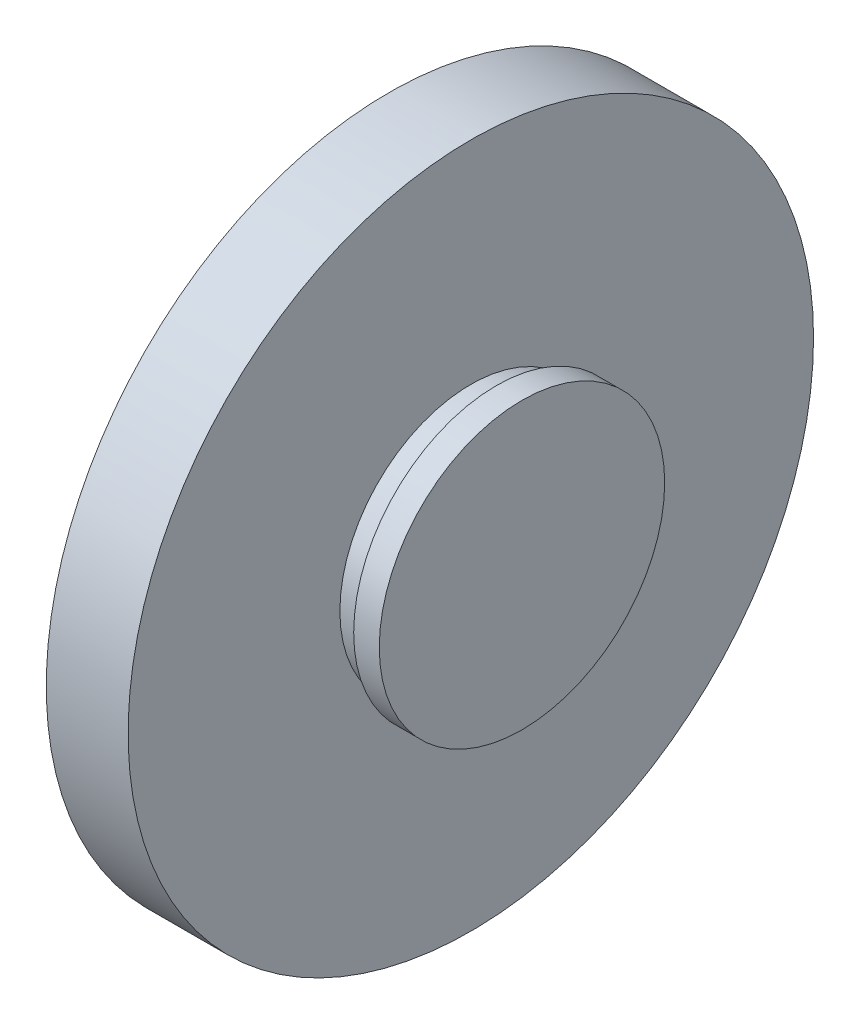
ISO-10303-21;
HEADER;
FILE_DESCRIPTION(('STEP AP214'),'2;1');
FILE_NAME('part.step','',(''),(''),'','','');
FILE_SCHEMA(('AUTOMOTIVE_DESIGN { 1 0 10303 214 1 1 1 1 }'));
ENDSEC;
DATA;
#1=APPLICATION_CONTEXT('core data for automotive mechanical design processes');
#2=APPLICATION_PROTOCOL_DEFINITION('international standard','automotive_design',2000,#1);
#3=PRODUCT_CONTEXT('',#1,'mechanical');
#4=PRODUCT('Part','Part','',(#3));
#5=PRODUCT_RELATED_PRODUCT_CATEGORY('part','',(#4));
#6=PRODUCT_DEFINITION_FORMATION('','',#4);
#7=PRODUCT_DEFINITION_CONTEXT('part definition',#1,'design');
#8=PRODUCT_DEFINITION('design','',#6,#7);
#9=PRODUCT_DEFINITION_SHAPE('','',#8);
#10=(LENGTH_UNIT() NAMED_UNIT(*) SI_UNIT(.MILLI.,.METRE.));
#11=(NAMED_UNIT(*) PLANE_ANGLE_UNIT() SI_UNIT($,.RADIAN.));
#12=(NAMED_UNIT(*) SI_UNIT($,.STERADIAN.) SOLID_ANGLE_UNIT());
#13=UNCERTAINTY_MEASURE_WITH_UNIT(LENGTH_MEASURE(1.E-05),#10,'distance_accuracy_value','');
#14=(GEOMETRIC_REPRESENTATION_CONTEXT(3) GLOBAL_UNCERTAINTY_ASSIGNED_CONTEXT((#13)) GLOBAL_UNIT_ASSIGNED_CONTEXT((#10,
#11,#12)) REPRESENTATION_CONTEXT('',''));
#15=CARTESIAN_POINT('',(0.,0.,0.));
#16=DIRECTION('',(0.,0.,1.));
#17=DIRECTION('',(1.,0.,0.));
#18=AXIS2_PLACEMENT_3D('',#15,#16,#17);
#19=CARTESIAN_POINT('',(8.,0.,0.));
#20=DIRECTION('',(-1.,0.,0.));
#21=DIRECTION('',(0.,0.,1.));
#22=AXIS2_PLACEMENT_3D('',#19,#20,#21);
#23=CYLINDRICAL_SURFACE('',#22,33.5);
#24=CARTESIAN_POINT('',(8.,0.,0.));
#25=DIRECTION('',(1.,0.,0.));
#26=DIRECTION('',(0.,0.,-1.));
#27=AXIS2_PLACEMENT_3D('',#24,#25,#26);
#28=CIRCLE('',#27,33.5);
#29=CARTESIAN_POINT('',(8.,0.,-33.5));
#30=VERTEX_POINT('',#29);
#31=EDGE_CURVE('E41',#30,#30,#28,.T.);
#32=ORIENTED_EDGE('',*,*,#31,.F.);
#33=EDGE_LOOP('',(#32));
#34=FACE_BOUND('',#33,.T.);
#35=CARTESIAN_POINT('',(0.,0.,0.));
#36=DIRECTION('',(1.,0.,0.));
#37=DIRECTION('',(0.,0.,-1.));
#38=AXIS2_PLACEMENT_3D('',#35,#36,#37);
#39=CIRCLE('',#38,33.5);
#40=CARTESIAN_POINT('',(0.,0.,-33.5));
#41=VERTEX_POINT('',#40);
#42=EDGE_CURVE('E36',#41,#41,#39,.T.);
#43=ORIENTED_EDGE('',*,*,#42,.T.);
#44=EDGE_LOOP('',(#43));
#45=FACE_BOUND('',#44,.T.);
#46=ADVANCED_FACE('F33',(#34,#45),#23,.T.);
#47=CARTESIAN_POINT('',(8.,0.,0.));
#48=DIRECTION('',(1.,0.,0.));
#49=DIRECTION('',(0.,0.,-1.));
#50=AXIS2_PLACEMENT_3D('',#47,#48,#49);
#51=PLANE('',#50);
#52=CARTESIAN_POINT('',(8.,0.,0.));
#53=DIRECTION('',(1.,0.,0.));
#54=DIRECTION('',(0.,0.,-1.));
#55=AXIS2_PLACEMENT_3D('',#52,#53,#54);
#56=CIRCLE('',#55,12.8);
#57=CARTESIAN_POINT('',(8.,0.,-12.8));
#58=VERTEX_POINT('',#57);
#59=EDGE_CURVE('E11',#58,#58,#56,.T.);
#60=ORIENTED_EDGE('',*,*,#59,.F.);
#61=EDGE_LOOP('',(#60));
#62=FACE_BOUND('',#61,.T.);
#63=ORIENTED_EDGE('',*,*,#31,.T.);
#64=EDGE_LOOP('',(#63));
#65=FACE_BOUND('',#64,.T.);
#66=ADVANCED_FACE('F226',(#62,#65),#51,.T.);
#67=CARTESIAN_POINT('',(0.,0.,0.));
#68=DIRECTION('',(1.,0.,0.));
#69=DIRECTION('',(0.,0.,-1.));
#70=AXIS2_PLACEMENT_3D('',#67,#68,#69);
#71=PLANE('',#70);
#72=DIRECTION('',(0.,-0.119879149923698,0.992788491781392));
#73=VECTOR('',#72,1.);
#74=CARTESIAN_POINT('',(0.,-6.5,-6.5));
#75=LINE('',#74,#73);
#76=CARTESIAN_POINT('',(0.,-4.00000000000001,-27.2039441890706));
#77=VERTEX_POINT('',#76);
#78=CARTESIAN_POINT('',(0.,-6.5,-6.5));
#79=VERTEX_POINT('',#78);
#80=EDGE_CURVE('E159',#77,#79,#75,.T.);
#81=ORIENTED_EDGE('',*,*,#80,.F.);
#82=CARTESIAN_POINT('',(0.,0.,-26.7209444326629));
#83=DIRECTION('',(-1.,0.,0.));
#84=DIRECTION('',(0.,0.,1.));
#85=AXIS2_PLACEMENT_3D('',#82,#83,#84);
#86=CIRCLE('',#85,4.02905556733709);
#87=CARTESIAN_POINT('',(0.,4.00000000000002,-27.2039441890706));
#88=VERTEX_POINT('',#87);
#89=EDGE_CURVE('E49',#88,#77,#86,.T.);
#90=ORIENTED_EDGE('',*,*,#89,.F.);
#91=DIRECTION('',(0.,-0.119879149923698,-0.992788491781392));
#92=VECTOR('',#91,1.);
#93=CARTESIAN_POINT('',(0.,4.00000000000002,-27.2039441890706));
#94=LINE('',#93,#92);
#95=CARTESIAN_POINT('',(0.,6.5,-6.5));
#96=VERTEX_POINT('',#95);
#97=EDGE_CURVE('E187',#96,#88,#94,.T.);
#98=ORIENTED_EDGE('',*,*,#97,.F.);
#99=DIRECTION('',(0.,-0.992788491781392,-0.119879149923698));
#100=VECTOR('',#99,1.);
#101=CARTESIAN_POINT('',(0.,6.5,-6.5));
#102=LINE('',#101,#100);
#103=CARTESIAN_POINT('',(0.,27.2039441890706,-4.));
#104=VERTEX_POINT('',#103);
#105=EDGE_CURVE('E185',#104,#96,#102,.T.);
#106=ORIENTED_EDGE('',*,*,#105,.F.);
#107=CARTESIAN_POINT('',(0.,26.7209444326629,0.));
#108=DIRECTION('',(-1.,0.,0.));
#109=DIRECTION('',(0.,0.,-1.));
#110=AXIS2_PLACEMENT_3D('',#107,#108,#109);
#111=CIRCLE('',#110,4.02905556733708);
#112=CARTESIAN_POINT('',(0.,27.2039441890706,4.));
#113=VERTEX_POINT('',#112);
#114=EDGE_CURVE('E133',#113,#104,#111,.T.);
#115=ORIENTED_EDGE('',*,*,#114,.F.);
#116=DIRECTION('',(0.,0.992788491781392,-0.119879149923698));
#117=VECTOR('',#116,1.);
#118=CARTESIAN_POINT('',(0.,27.2039441890706,4.));
#119=LINE('',#118,#117);
#120=CARTESIAN_POINT('',(0.,6.5,6.5));
#121=VERTEX_POINT('',#120);
#122=EDGE_CURVE('E181',#121,#113,#119,.T.);
#123=ORIENTED_EDGE('',*,*,#122,.F.);
#124=DIRECTION('',(0.,0.119879149923698,-0.992788491781392));
#125=VECTOR('',#124,1.);
#126=CARTESIAN_POINT('',(0.,6.5,6.5));
#127=LINE('',#126,#125);
#128=CARTESIAN_POINT('',(0.,4.00000000000002,27.2039441890706));
#129=VERTEX_POINT('',#128);
#130=EDGE_CURVE('E178',#129,#121,#127,.T.);
#131=ORIENTED_EDGE('',*,*,#130,.F.);
#132=CARTESIAN_POINT('',(0.,0.,26.7209444326629));
#133=DIRECTION('',(-1.,0.,0.));
#134=DIRECTION('',(0.,0.,-1.));
#135=AXIS2_PLACEMENT_3D('',#132,#133,#134);
#136=CIRCLE('',#135,4.02905556733709);
#137=CARTESIAN_POINT('',(0.,-4.00000000000002,27.2039441890706));
#138=VERTEX_POINT('',#137);
#139=EDGE_CURVE('E175',#138,#129,#136,.T.);
#140=ORIENTED_EDGE('',*,*,#139,.F.);
#141=DIRECTION('',(0.,0.119879149923698,0.992788491781392));
#142=VECTOR('',#141,1.);
#143=CARTESIAN_POINT('',(0.,-4.00000000000002,27.2039441890706));
#144=LINE('',#143,#142);
#145=CARTESIAN_POINT('',(0.,-6.5,6.5));
#146=VERTEX_POINT('',#145);
#147=EDGE_CURVE('E172',#146,#138,#144,.T.);
#148=ORIENTED_EDGE('',*,*,#147,.F.);
#149=DIRECTION('',(0.,0.992788491781392,0.119879149923698));
#150=VECTOR('',#149,1.);
#151=CARTESIAN_POINT('',(0.,-6.5,6.5));
#152=LINE('',#151,#150);
#153=CARTESIAN_POINT('',(0.,-27.2039441890706,4.));
#154=VERTEX_POINT('',#153);
#155=EDGE_CURVE('E169',#154,#146,#152,.T.);
#156=ORIENTED_EDGE('',*,*,#155,.F.);
#157=CARTESIAN_POINT('',(0.,-26.7209444326629,0.));
#158=DIRECTION('',(-1.,0.,0.));
#159=DIRECTION('',(0.,0.,-1.));
#160=AXIS2_PLACEMENT_3D('',#157,#158,#159);
#161=CIRCLE('',#160,4.02905556733708);
#162=CARTESIAN_POINT('',(0.,-27.2039441890706,-4.));
#163=VERTEX_POINT('',#162);
#164=EDGE_CURVE('E166',#163,#154,#161,.T.);
#165=ORIENTED_EDGE('',*,*,#164,.F.);
#166=DIRECTION('',(0.,-0.992788491781392,0.119879149923698));
#167=VECTOR('',#166,1.);
#168=CARTESIAN_POINT('',(0.,-27.2039441890706,-4.));
#169=LINE('',#168,#167);
#170=EDGE_CURVE('E163',#79,#163,#169,.T.);
#171=ORIENTED_EDGE('',*,*,#170,.F.);
#172=EDGE_LOOP('',(#81,#90,#98,#106,#115,#123,#131,#140,#148,#156,#165,#171));
#173=FACE_BOUND('',#172,.T.);
#174=ORIENTED_EDGE('',*,*,#42,.F.);
#175=EDGE_LOOP('',(#174));
#176=FACE_BOUND('',#175,.T.);
#177=ADVANCED_FACE('F223',(#173,#176),#71,.F.);
#178=CARTESIAN_POINT('',(10.5,0.,0.));
#179=DIRECTION('',(-1.,0.,0.));
#180=DIRECTION('',(0.,0.,1.));
#181=AXIS2_PLACEMENT_3D('',#178,#179,#180);
#182=CYLINDRICAL_SURFACE('',#181,12.8);
#183=CARTESIAN_POINT('',(10.5,0.,0.));
#184=DIRECTION('',(1.,0.,0.));
#185=DIRECTION('',(0.,0.,-1.));
#186=AXIS2_PLACEMENT_3D('',#183,#184,#185);
#187=CIRCLE('',#186,12.8);
#188=CARTESIAN_POINT('',(10.5,0.,-12.8));
#189=VERTEX_POINT('',#188);
#190=EDGE_CURVE('E212',#189,#189,#187,.T.);
#191=ORIENTED_EDGE('',*,*,#190,.F.);
#192=EDGE_LOOP('',(#191));
#193=FACE_BOUND('',#192,.T.);
#194=ORIENTED_EDGE('',*,*,#59,.T.);
#195=EDGE_LOOP('',(#194));
#196=FACE_BOUND('',#195,.T.);
#197=ADVANCED_FACE('F225',(#193,#196),#182,.T.);
#198=CARTESIAN_POINT('',(13.,0.,0.));
#199=DIRECTION('',(-1.,0.,0.));
#200=DIRECTION('',(0.,0.,1.));
#201=AXIS2_PLACEMENT_3D('',#198,#199,#200);
#202=CYLINDRICAL_SURFACE('',#201,13.95);
#203=CARTESIAN_POINT('',(13.,0.,0.));
#204=DIRECTION('',(1.,0.,0.));
#205=DIRECTION('',(0.,0.,-1.));
#206=AXIS2_PLACEMENT_3D('',#203,#204,#205);
#207=CIRCLE('',#206,13.95);
#208=CARTESIAN_POINT('',(13.,0.,-13.95));
#209=VERTEX_POINT('',#208);
#210=EDGE_CURVE('E209',#209,#209,#207,.T.);
#211=ORIENTED_EDGE('',*,*,#210,.F.);
#212=EDGE_LOOP('',(#211));
#213=FACE_BOUND('',#212,.T.);
#214=CARTESIAN_POINT('',(10.5,0.,0.));
#215=DIRECTION('',(1.,0.,0.));
#216=DIRECTION('',(0.,0.,-1.));
#217=AXIS2_PLACEMENT_3D('',#214,#215,#216);
#218=CIRCLE('',#217,13.95);
#219=CARTESIAN_POINT('',(10.5,0.,-13.95));
#220=VERTEX_POINT('',#219);
#221=EDGE_CURVE('E191',#220,#220,#218,.T.);
#222=ORIENTED_EDGE('',*,*,#221,.T.);
#223=EDGE_LOOP('',(#222));
#224=FACE_BOUND('',#223,.T.);
#225=ADVANCED_FACE('F232',(#213,#224),#202,.T.);
#226=CARTESIAN_POINT('',(13.,0.,0.));
#227=DIRECTION('',(1.,0.,0.));
#228=DIRECTION('',(0.,0.,-1.));
#229=AXIS2_PLACEMENT_3D('',#226,#227,#228);
#230=PLANE('',#229);
#231=ORIENTED_EDGE('',*,*,#210,.T.);
#232=EDGE_LOOP('',(#231));
#233=FACE_BOUND('',#232,.T.);
#234=ADVANCED_FACE('F262',(#233),#230,.T.);
#235=CARTESIAN_POINT('',(10.5,0.,0.));
#236=DIRECTION('',(1.,0.,0.));
#237=DIRECTION('',(0.,0.,-1.));
#238=AXIS2_PLACEMENT_3D('',#235,#236,#237);
#239=PLANE('',#238);
#240=ORIENTED_EDGE('',*,*,#190,.T.);
#241=EDGE_LOOP('',(#240));
#242=FACE_BOUND('',#241,.T.);
#243=ORIENTED_EDGE('',*,*,#221,.F.);
#244=EDGE_LOOP('',(#243));
#245=FACE_BOUND('',#244,.T.);
#246=ADVANCED_FACE('F272',(#242,#245),#239,.F.);
#247=CARTESIAN_POINT('',(5.5,0.,-26.7209444326629));
#248=DIRECTION('',(-1.,0.,0.));
#249=DIRECTION('',(0.,0.,1.));
#250=AXIS2_PLACEMENT_3D('',#247,#248,#249);
#251=CYLINDRICAL_SURFACE('',#250,4.02905556733709);
#252=ORIENTED_EDGE('',*,*,#89,.T.);
#253=DIRECTION('',(-1.,0.,0.));
#254=VECTOR('',#253,1.);
#255=CARTESIAN_POINT('',(5.5,-4.00000000000002,-27.2039441890706));
#256=LINE('',#255,#254);
#257=CARTESIAN_POINT('',(5.5,-4.00000000000002,-27.2039441890706));
#258=VERTEX_POINT('',#257);
#259=EDGE_CURVE('E97',#258,#77,#256,.T.);
#260=ORIENTED_EDGE('',*,*,#259,.F.);
#261=CARTESIAN_POINT('',(5.5,0.,-26.7209444326629));
#262=DIRECTION('',(-1.,0.,0.));
#263=DIRECTION('',(0.,0.,1.));
#264=AXIS2_PLACEMENT_3D('',#261,#262,#263);
#265=CIRCLE('',#264,4.02905556733709);
#266=CARTESIAN_POINT('',(5.5,4.00000000000002,-27.2039441890706));
#267=VERTEX_POINT('',#266);
#268=EDGE_CURVE('E189',#267,#258,#265,.T.);
#269=ORIENTED_EDGE('',*,*,#268,.F.);
#270=DIRECTION('',(-1.,0.,0.));
#271=VECTOR('',#270,1.);
#272=CARTESIAN_POINT('',(5.5,4.00000000000002,-27.2039441890706));
#273=LINE('',#272,#271);
#274=EDGE_CURVE('E57',#267,#88,#273,.T.);
#275=ORIENTED_EDGE('',*,*,#274,.T.);
#276=EDGE_LOOP('',(#252,#260,#269,#275));
#277=FACE_BOUND('',#276,.T.);
#278=ADVANCED_FACE('F281',(#277),#251,.F.);
#279=CARTESIAN_POINT('',(5.5,4.00000000000002,-27.2039441890706));
#280=DIRECTION('',(0.,0.992788491781392,-0.119879149923698));
#281=DIRECTION('',(0.,0.119879149923698,0.992788491781392));
#282=AXIS2_PLACEMENT_3D('',#279,#280,#281);
#283=PLANE('',#282);
#284=ORIENTED_EDGE('',*,*,#97,.T.);
#285=ORIENTED_EDGE('',*,*,#274,.F.);
#286=DIRECTION('',(0.,-0.119879149923698,-0.992788491781392));
#287=VECTOR('',#286,1.);
#288=CARTESIAN_POINT('',(5.5,4.00000000000002,-27.2039441890706));
#289=LINE('',#288,#287);
#290=CARTESIAN_POINT('',(5.5,6.5,-6.5));
#291=VERTEX_POINT('',#290);
#292=EDGE_CURVE('E145',#291,#267,#289,.T.);
#293=ORIENTED_EDGE('',*,*,#292,.F.);
#294=DIRECTION('',(-1.,0.,0.));
#295=VECTOR('',#294,1.);
#296=CARTESIAN_POINT('',(5.5,6.5,-6.5));
#297=LINE('',#296,#295);
#298=EDGE_CURVE('E137',#291,#96,#297,.T.);
#299=ORIENTED_EDGE('',*,*,#298,.T.);
#300=EDGE_LOOP('',(#284,#285,#293,#299));
#301=FACE_BOUND('',#300,.T.);
#302=ADVANCED_FACE('F295',(#301),#283,.F.);
#303=CARTESIAN_POINT('',(5.5,6.5,-6.5));
#304=DIRECTION('',(0.,0.119879149923698,-0.992788491781392));
#305=DIRECTION('',(0.,0.992788491781392,0.119879149923698));
#306=AXIS2_PLACEMENT_3D('',#303,#304,#305);
#307=PLANE('',#306);
#308=ORIENTED_EDGE('',*,*,#105,.T.);
#309=ORIENTED_EDGE('',*,*,#298,.F.);
#310=DIRECTION('',(0.,-0.992788491781392,-0.119879149923698));
#311=VECTOR('',#310,1.);
#312=CARTESIAN_POINT('',(5.5,6.5,-6.5));
#313=LINE('',#312,#311);
#314=CARTESIAN_POINT('',(5.5,27.2039441890706,-4.));
#315=VERTEX_POINT('',#314);
#316=EDGE_CURVE('E141',#315,#291,#313,.T.);
#317=ORIENTED_EDGE('',*,*,#316,.F.);
#318=DIRECTION('',(-1.,0.,0.));
#319=VECTOR('',#318,1.);
#320=CARTESIAN_POINT('',(5.5,27.2039441890706,-4.));
#321=LINE('',#320,#319);
#322=EDGE_CURVE('E126',#315,#104,#321,.T.);
#323=ORIENTED_EDGE('',*,*,#322,.T.);
#324=EDGE_LOOP('',(#308,#309,#317,#323));
#325=FACE_BOUND('',#324,.T.);
#326=ADVANCED_FACE('F142',(#325),#307,.F.);
#327=CARTESIAN_POINT('',(5.5,26.7209444326629,0.));
#328=DIRECTION('',(-1.,0.,0.));
#329=DIRECTION('',(0.,0.,1.));
#330=AXIS2_PLACEMENT_3D('',#327,#328,#329);
#331=CYLINDRICAL_SURFACE('',#330,4.02905556733708);
#332=ORIENTED_EDGE('',*,*,#114,.T.);
#333=ORIENTED_EDGE('',*,*,#322,.F.);
#334=CARTESIAN_POINT('',(5.5,26.7209444326629,0.));
#335=DIRECTION('',(-1.,0.,0.));
#336=DIRECTION('',(0.,0.,-1.));
#337=AXIS2_PLACEMENT_3D('',#334,#335,#336);
#338=CIRCLE('',#337,4.02905556733708);
#339=CARTESIAN_POINT('',(5.5,27.2039441890706,4.));
#340=VERTEX_POINT('',#339);
#341=EDGE_CURVE('E130',#340,#315,#338,.T.);
#342=ORIENTED_EDGE('',*,*,#341,.F.);
#343=DIRECTION('',(-1.,0.,0.));
#344=VECTOR('',#343,1.);
#345=CARTESIAN_POINT('',(5.5,27.2039441890706,4.));
#346=LINE('',#345,#344);
#347=EDGE_CURVE('E138',#340,#113,#346,.T.);
#348=ORIENTED_EDGE('',*,*,#347,.T.);
#349=EDGE_LOOP('',(#332,#333,#342,#348));
#350=FACE_BOUND('',#349,.T.);
#351=ADVANCED_FACE('F128',(#350),#331,.F.);
#352=CARTESIAN_POINT('',(5.5,27.2039441890706,4.));
#353=DIRECTION('',(0.,0.119879149923698,0.992788491781392));
#354=DIRECTION('',(0.,-0.992788491781392,0.119879149923698));
#355=AXIS2_PLACEMENT_3D('',#352,#353,#354);
#356=PLANE('',#355);
#357=ORIENTED_EDGE('',*,*,#122,.T.);
#358=ORIENTED_EDGE('',*,*,#347,.F.);
#359=DIRECTION('',(0.,0.992788491781392,-0.119879149923698));
#360=VECTOR('',#359,1.);
#361=CARTESIAN_POINT('',(5.5,27.2039441890706,4.));
#362=LINE('',#361,#360);
#363=CARTESIAN_POINT('',(5.5,6.5,6.5));
#364=VERTEX_POINT('',#363);
#365=EDGE_CURVE('E151',#364,#340,#362,.T.);
#366=ORIENTED_EDGE('',*,*,#365,.F.);
#367=DIRECTION('',(-1.,0.,0.));
#368=VECTOR('',#367,1.);
#369=CARTESIAN_POINT('',(5.5,6.5,6.5));
#370=LINE('',#369,#368);
#371=EDGE_CURVE('E194',#364,#121,#370,.T.);
#372=ORIENTED_EDGE('',*,*,#371,.T.);
#373=EDGE_LOOP('',(#357,#358,#366,#372));
#374=FACE_BOUND('',#373,.T.);
#375=ADVANCED_FACE('F320',(#374),#356,.F.);
#376=CARTESIAN_POINT('',(5.5,6.5,6.5));
#377=DIRECTION('',(0.,0.992788491781392,0.119879149923698));
#378=DIRECTION('',(0.,-0.119879149923698,0.992788491781392));
#379=AXIS2_PLACEMENT_3D('',#376,#377,#378);
#380=PLANE('',#379);
#381=ORIENTED_EDGE('',*,*,#130,.T.);
#382=ORIENTED_EDGE('',*,*,#371,.F.);
#383=DIRECTION('',(0.,0.119879149923698,-0.992788491781392));
#384=VECTOR('',#383,1.);
#385=CARTESIAN_POINT('',(5.5,6.5,6.5));
#386=LINE('',#385,#384);
#387=CARTESIAN_POINT('',(5.5,4.00000000000002,27.2039441890706));
#388=VERTEX_POINT('',#387);
#389=EDGE_CURVE('E153',#388,#364,#386,.T.);
#390=ORIENTED_EDGE('',*,*,#389,.F.);
#391=DIRECTION('',(-1.,0.,0.));
#392=VECTOR('',#391,1.);
#393=CARTESIAN_POINT('',(5.5,4.00000000000002,27.2039441890706));
#394=LINE('',#393,#392);
#395=EDGE_CURVE('E196',#388,#129,#394,.T.);
#396=ORIENTED_EDGE('',*,*,#395,.T.);
#397=EDGE_LOOP('',(#381,#382,#390,#396));
#398=FACE_BOUND('',#397,.T.);
#399=ADVANCED_FACE('F329',(#398),#380,.F.);
#400=CARTESIAN_POINT('',(5.5,0.,26.7209444326629));
#401=DIRECTION('',(-1.,0.,0.));
#402=DIRECTION('',(0.,0.,1.));
#403=AXIS2_PLACEMENT_3D('',#400,#401,#402);
#404=CYLINDRICAL_SURFACE('',#403,4.02905556733709);
#405=ORIENTED_EDGE('',*,*,#139,.T.);
#406=ORIENTED_EDGE('',*,*,#395,.F.);
#407=CARTESIAN_POINT('',(5.5,0.,26.7209444326629));
#408=DIRECTION('',(-1.,0.,0.));
#409=DIRECTION('',(0.,0.,-1.));
#410=AXIS2_PLACEMENT_3D('',#407,#408,#409);
#411=CIRCLE('',#410,4.02905556733709);
#412=CARTESIAN_POINT('',(5.5,-4.00000000000002,27.2039441890706));
#413=VERTEX_POINT('',#412);
#414=EDGE_CURVE('E455',#413,#388,#411,.T.);
#415=ORIENTED_EDGE('',*,*,#414,.F.);
#416=DIRECTION('',(-1.,0.,0.));
#417=VECTOR('',#416,1.);
#418=CARTESIAN_POINT('',(5.5,-4.00000000000002,27.2039441890706));
#419=LINE('',#418,#417);
#420=EDGE_CURVE('E198',#413,#138,#419,.T.);
#421=ORIENTED_EDGE('',*,*,#420,.T.);
#422=EDGE_LOOP('',(#405,#406,#415,#421));
#423=FACE_BOUND('',#422,.T.);
#424=ADVANCED_FACE('F339',(#423),#404,.F.);
#425=CARTESIAN_POINT('',(5.5,-4.00000000000002,27.2039441890706));
#426=DIRECTION('',(0.,-0.992788491781392,0.119879149923698));
#427=DIRECTION('',(0.,-0.119879149923698,-0.992788491781392));
#428=AXIS2_PLACEMENT_3D('',#425,#426,#427);
#429=PLANE('',#428);
#430=ORIENTED_EDGE('',*,*,#147,.T.);
#431=ORIENTED_EDGE('',*,*,#420,.F.);
#432=DIRECTION('',(0.,0.119879149923698,0.992788491781392));
#433=VECTOR('',#432,1.);
#434=CARTESIAN_POINT('',(5.5,-4.00000000000002,27.2039441890706));
#435=LINE('',#434,#433);
#436=CARTESIAN_POINT('',(5.5,-6.5,6.5));
#437=VERTEX_POINT('',#436);
#438=EDGE_CURVE('E452',#437,#413,#435,.T.);
#439=ORIENTED_EDGE('',*,*,#438,.F.);
#440=DIRECTION('',(-1.,0.,0.));
#441=VECTOR('',#440,1.);
#442=CARTESIAN_POINT('',(5.5,-6.5,6.5));
#443=LINE('',#442,#441);
#444=EDGE_CURVE('E200',#437,#146,#443,.T.);
#445=ORIENTED_EDGE('',*,*,#444,.T.);
#446=EDGE_LOOP('',(#430,#431,#439,#445));
#447=FACE_BOUND('',#446,.T.);
#448=ADVANCED_FACE('F349',(#447),#429,.F.);
#449=CARTESIAN_POINT('',(5.5,-6.5,6.5));
#450=DIRECTION('',(0.,-0.119879149923698,0.992788491781392));
#451=DIRECTION('',(0.,-0.992788491781392,-0.119879149923698));
#452=AXIS2_PLACEMENT_3D('',#449,#450,#451);
#453=PLANE('',#452);
#454=ORIENTED_EDGE('',*,*,#155,.T.);
#455=ORIENTED_EDGE('',*,*,#444,.F.);
#456=DIRECTION('',(0.,0.992788491781392,0.119879149923698));
#457=VECTOR('',#456,1.);
#458=CARTESIAN_POINT('',(5.5,-6.5,6.5));
#459=LINE('',#458,#457);
#460=CARTESIAN_POINT('',(5.5,-27.2039441890706,4.));
#461=VERTEX_POINT('',#460);
#462=EDGE_CURVE('E449',#461,#437,#459,.T.);
#463=ORIENTED_EDGE('',*,*,#462,.F.);
#464=DIRECTION('',(-1.,0.,0.));
#465=VECTOR('',#464,1.);
#466=CARTESIAN_POINT('',(5.5,-27.2039441890706,4.));
#467=LINE('',#466,#465);
#468=EDGE_CURVE('E202',#461,#154,#467,.T.);
#469=ORIENTED_EDGE('',*,*,#468,.T.);
#470=EDGE_LOOP('',(#454,#455,#463,#469));
#471=FACE_BOUND('',#470,.T.);
#472=ADVANCED_FACE('F359',(#471),#453,.F.);
#473=CARTESIAN_POINT('',(5.5,-26.7209444326629,0.));
#474=DIRECTION('',(-1.,0.,0.));
#475=DIRECTION('',(0.,0.,1.));
#476=AXIS2_PLACEMENT_3D('',#473,#474,#475);
#477=CYLINDRICAL_SURFACE('',#476,4.02905556733708);
#478=ORIENTED_EDGE('',*,*,#164,.T.);
#479=ORIENTED_EDGE('',*,*,#468,.F.);
#480=CARTESIAN_POINT('',(5.5,-26.7209444326629,0.));
#481=DIRECTION('',(-1.,0.,0.));
#482=DIRECTION('',(0.,0.,-1.));
#483=AXIS2_PLACEMENT_3D('',#480,#481,#482);
#484=CIRCLE('',#483,4.02905556733708);
#485=CARTESIAN_POINT('',(5.5,-27.2039441890706,-4.));
#486=VERTEX_POINT('',#485);
#487=EDGE_CURVE('E446',#486,#461,#484,.T.);
#488=ORIENTED_EDGE('',*,*,#487,.F.);
#489=DIRECTION('',(-1.,0.,0.));
#490=VECTOR('',#489,1.);
#491=CARTESIAN_POINT('',(5.5,-27.2039441890706,-4.));
#492=LINE('',#491,#490);
#493=EDGE_CURVE('E204',#486,#163,#492,.T.);
#494=ORIENTED_EDGE('',*,*,#493,.T.);
#495=EDGE_LOOP('',(#478,#479,#488,#494));
#496=FACE_BOUND('',#495,.T.);
#497=ADVANCED_FACE('F369',(#496),#477,.F.);
#498=CARTESIAN_POINT('',(5.5,-27.2039441890706,-4.));
#499=DIRECTION('',(0.,-0.119879149923698,-0.992788491781392));
#500=DIRECTION('',(0.,0.992788491781392,-0.119879149923698));
#501=AXIS2_PLACEMENT_3D('',#498,#499,#500);
#502=PLANE('',#501);
#503=ORIENTED_EDGE('',*,*,#170,.T.);
#504=ORIENTED_EDGE('',*,*,#493,.F.);
#505=DIRECTION('',(0.,-0.992788491781392,0.119879149923698));
#506=VECTOR('',#505,1.);
#507=CARTESIAN_POINT('',(5.5,-27.2039441890706,-4.));
#508=LINE('',#507,#506);
#509=CARTESIAN_POINT('',(5.5,-6.5,-6.5));
#510=VERTEX_POINT('',#509);
#511=EDGE_CURVE('E443',#510,#486,#508,.T.);
#512=ORIENTED_EDGE('',*,*,#511,.F.);
#513=DIRECTION('',(-1.,0.,0.));
#514=VECTOR('',#513,1.);
#515=CARTESIAN_POINT('',(5.5,-6.5,-6.5));
#516=LINE('',#515,#514);
#517=EDGE_CURVE('E206',#510,#79,#516,.T.);
#518=ORIENTED_EDGE('',*,*,#517,.T.);
#519=EDGE_LOOP('',(#503,#504,#512,#518));
#520=FACE_BOUND('',#519,.T.);
#521=ADVANCED_FACE('F379',(#520),#502,.F.);
#522=CARTESIAN_POINT('',(5.5,-6.5,-6.5));
#523=DIRECTION('',(0.,-0.992788491781392,-0.119879149923698));
#524=DIRECTION('',(0.,0.119879149923698,-0.992788491781392));
#525=AXIS2_PLACEMENT_3D('',#522,#523,#524);
#526=PLANE('',#525);
#527=ORIENTED_EDGE('',*,*,#80,.T.);
#528=ORIENTED_EDGE('',*,*,#517,.F.);
#529=DIRECTION('',(0.,-0.119879149923698,0.992788491781392));
#530=VECTOR('',#529,1.);
#531=CARTESIAN_POINT('',(5.5,-6.5,-6.5));
#532=LINE('',#531,#530);
#533=EDGE_CURVE('E440',#258,#510,#532,.T.);
#534=ORIENTED_EDGE('',*,*,#533,.F.);
#535=ORIENTED_EDGE('',*,*,#259,.T.);
#536=EDGE_LOOP('',(#527,#528,#534,#535));
#537=FACE_BOUND('',#536,.T.);
#538=ADVANCED_FACE('F389',(#537),#526,.F.);
#539=CARTESIAN_POINT('',(5.5,0.,-26.7209444326629));
#540=DIRECTION('',(-1.,0.,0.));
#541=DIRECTION('',(0.,0.,1.));
#542=AXIS2_PLACEMENT_3D('',#539,#540,#541);
#543=PLANE('',#542);
#544=CARTESIAN_POINT('',(5.5,0.,0.));
#545=DIRECTION('',(-1.,0.,0.));
#546=DIRECTION('',(0.,0.,1.));
#547=AXIS2_PLACEMENT_3D('',#544,#545,#546);
#548=CIRCLE('',#547,6.);
#549=CARTESIAN_POINT('',(5.5,0.,6.));
#550=VERTEX_POINT('',#549);
#551=EDGE_CURVE('E434',#550,#550,#548,.T.);
#552=ORIENTED_EDGE('',*,*,#551,.F.);
#553=EDGE_LOOP('',(#552));
#554=FACE_BOUND('',#553,.T.);
#555=ORIENTED_EDGE('',*,*,#268,.T.);
#556=ORIENTED_EDGE('',*,*,#533,.T.);
#557=ORIENTED_EDGE('',*,*,#511,.T.);
#558=ORIENTED_EDGE('',*,*,#487,.T.);
#559=ORIENTED_EDGE('',*,*,#462,.T.);
#560=ORIENTED_EDGE('',*,*,#438,.T.);
#561=ORIENTED_EDGE('',*,*,#414,.T.);
#562=ORIENTED_EDGE('',*,*,#389,.T.);
#563=ORIENTED_EDGE('',*,*,#365,.T.);
#564=ORIENTED_EDGE('',*,*,#341,.T.);
#565=ORIENTED_EDGE('',*,*,#316,.T.);
#566=ORIENTED_EDGE('',*,*,#292,.T.);
#567=EDGE_LOOP('',(#555,#556,#557,#558,#559,#560,#561,#562,#563,#564,#565,#566));
#568=FACE_BOUND('',#567,.T.);
#569=ADVANCED_FACE('F148',(#554,#568),#543,.T.);
#570=CARTESIAN_POINT('',(8.7,0.,0.));
#571=DIRECTION('',(-1.,0.,0.));
#572=DIRECTION('',(0.,0.,1.));
#573=AXIS2_PLACEMENT_3D('',#570,#571,#572);
#574=CYLINDRICAL_SURFACE('',#573,6.);
#575=CARTESIAN_POINT('',(8.7,0.,0.));
#576=DIRECTION('',(-1.,0.,0.));
#577=DIRECTION('',(0.,0.,1.));
#578=AXIS2_PLACEMENT_3D('',#575,#576,#577);
#579=CIRCLE('',#578,6.);
#580=CARTESIAN_POINT('',(8.7,0.,6.));
#581=VERTEX_POINT('',#580);
#582=EDGE_CURVE('E160',#581,#581,#579,.T.);
#583=ORIENTED_EDGE('',*,*,#582,.F.);
#584=EDGE_LOOP('',(#583));
#585=FACE_BOUND('',#584,.T.);
#586=ORIENTED_EDGE('',*,*,#551,.T.);
#587=EDGE_LOOP('',(#586));
#588=FACE_BOUND('',#587,.T.);
#589=ADVANCED_FACE('F408',(#585,#588),#574,.F.);
#590=CARTESIAN_POINT('',(8.7,0.,0.));
#591=DIRECTION('',(-1.,0.,0.));
#592=DIRECTION('',(0.,0.,1.));
#593=AXIS2_PLACEMENT_3D('',#590,#591,#592);
#594=PLANE('',#593);
#595=ORIENTED_EDGE('',*,*,#582,.T.);
#596=EDGE_LOOP('',(#595));
#597=FACE_BOUND('',#596,.T.);
#598=ADVANCED_FACE('F418',(#597),#594,.T.);
#599=CLOSED_SHELL('',(#46,#66,#177,#197,#225,#234,#246,#278,#302,#326,#351,#375,#399,#424,#448,
#472,#497,#521,#538,#569,#589,#598));
#600=MANIFOLD_SOLID_BREP('B2',#599);
#601=ADVANCED_BREP_SHAPE_REPRESENTATION('',(#18,#600),#14);
#602=SHAPE_DEFINITION_REPRESENTATION(#9,#601);
ENDSEC;
END-ISO-10303-21;
